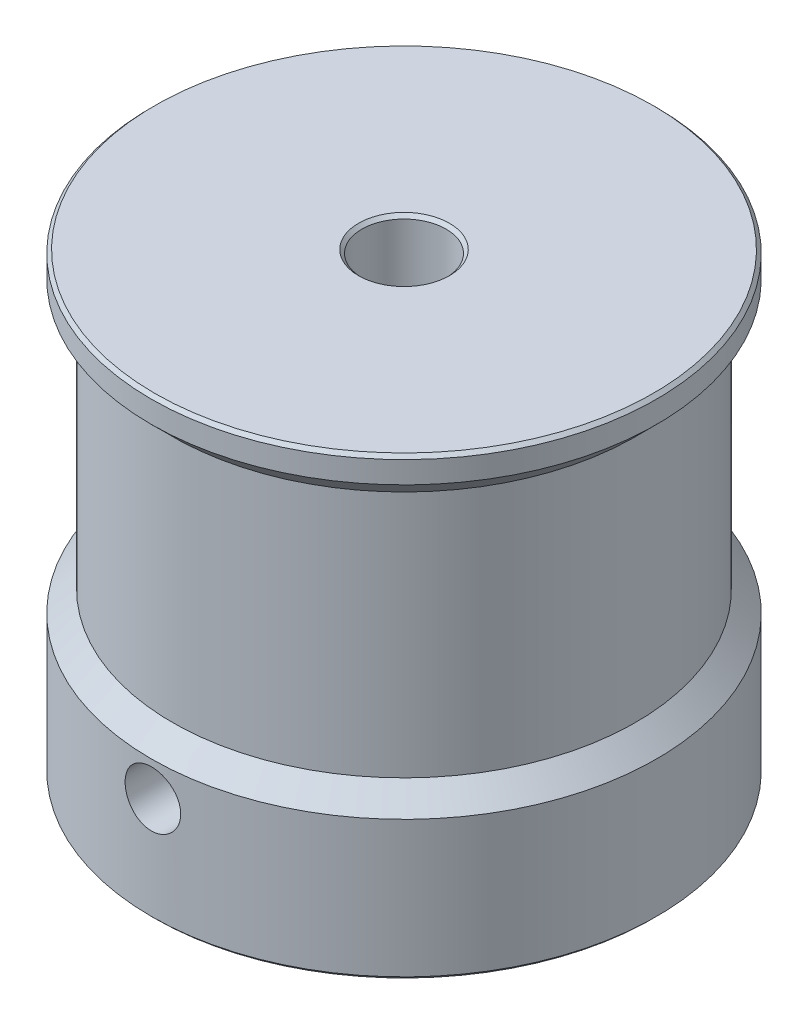
ISO-10303-21;
HEADER;
FILE_DESCRIPTION(('STEP AP214'),'2;1');
FILE_NAME('part.step','',(''),(''),'','','');
FILE_SCHEMA(('AUTOMOTIVE_DESIGN { 1 0 10303 214 1 1 1 1 }'));
ENDSEC;
DATA;
#1=APPLICATION_CONTEXT('core data for automotive mechanical design processes');
#2=APPLICATION_PROTOCOL_DEFINITION('international standard','automotive_design',2000,#1);
#3=PRODUCT_CONTEXT('',#1,'mechanical');
#4=PRODUCT('Part','Part','',(#3));
#5=PRODUCT_RELATED_PRODUCT_CATEGORY('part','',(#4));
#6=PRODUCT_DEFINITION_FORMATION('','',#4);
#7=PRODUCT_DEFINITION_CONTEXT('part definition',#1,'design');
#8=PRODUCT_DEFINITION('design','',#6,#7);
#9=PRODUCT_DEFINITION_SHAPE('','',#8);
#10=(LENGTH_UNIT() NAMED_UNIT(*) SI_UNIT(.MILLI.,.METRE.));
#11=(NAMED_UNIT(*) PLANE_ANGLE_UNIT() SI_UNIT($,.RADIAN.));
#12=(NAMED_UNIT(*) SI_UNIT($,.STERADIAN.) SOLID_ANGLE_UNIT());
#13=UNCERTAINTY_MEASURE_WITH_UNIT(LENGTH_MEASURE(1.E-05),#10,'distance_accuracy_value','');
#14=(GEOMETRIC_REPRESENTATION_CONTEXT(3) GLOBAL_UNCERTAINTY_ASSIGNED_CONTEXT((#13)) GLOBAL_UNIT_ASSIGNED_CONTEXT((#10,
#11,#12)) REPRESENTATION_CONTEXT('',''));
#15=CARTESIAN_POINT('',(0.,0.,0.));
#16=DIRECTION('',(0.,0.,1.));
#17=DIRECTION('',(1.,0.,0.));
#18=AXIS2_PLACEMENT_3D('',#15,#16,#17);
#19=CARTESIAN_POINT('',(11.5,2.5,0.));
#20=DIRECTION('',(0.,-1.,0.));
#21=DIRECTION('',(0.,0.,-1.));
#22=AXIS2_PLACEMENT_3D('',#19,#20,#21);
#23=PLANE('',#22);
#24=CARTESIAN_POINT('',(0.,2.5,0.));
#25=DIRECTION('',(0.,-1.,0.));
#26=DIRECTION('',(0.,0.,-1.));
#27=AXIS2_PLACEMENT_3D('',#24,#25,#26);
#28=CIRCLE('',#27,2.70000000000001);
#29=CARTESIAN_POINT('',(0.,2.5,-2.70000000000001));
#30=VERTEX_POINT('',#29);
#31=EDGE_CURVE('E76',#30,#30,#28,.F.);
#32=ORIENTED_EDGE('',*,*,#31,.T.);
#33=EDGE_LOOP('',(#32));
#34=FACE_BOUND('',#33,.T.);
#35=CARTESIAN_POINT('',(0.,2.5,0.));
#36=DIRECTION('',(0.,-1.,0.));
#37=DIRECTION('',(0.,0.,-1.));
#38=AXIS2_PLACEMENT_3D('',#35,#36,#37);
#39=CIRCLE('',#38,11.5);
#40=CARTESIAN_POINT('',(0.,2.5,-11.5));
#41=VERTEX_POINT('',#40);
#42=EDGE_CURVE('E88',#41,#41,#39,.T.);
#43=ORIENTED_EDGE('',*,*,#42,.T.);
#44=EDGE_LOOP('',(#43));
#45=FACE_BOUND('',#44,.T.);
#46=ADVANCED_FACE('F40',(#34,#45),#23,.T.);
#47=CARTESIAN_POINT('',(0.,0.,0.));
#48=DIRECTION('',(0.,-1.,0.));
#49=DIRECTION('',(0.,0.,-1.));
#50=AXIS2_PLACEMENT_3D('',#47,#48,#49);
#51=CYLINDRICAL_SURFACE('',#50,11.5);
#52=CARTESIAN_POINT('',(0.,0.200000000000007,0.));
#53=DIRECTION('',(0.,-1.,0.));
#54=DIRECTION('',(0.,0.,-1.));
#55=AXIS2_PLACEMENT_3D('',#52,#53,#54);
#56=CIRCLE('',#55,11.5);
#57=CARTESIAN_POINT('',(0.,0.200000000000007,-11.5));
#58=VERTEX_POINT('',#57);
#59=EDGE_CURVE('E58',#58,#58,#56,.T.);
#60=ORIENTED_EDGE('',*,*,#59,.T.);
#61=EDGE_LOOP('',(#60));
#62=FACE_BOUND('',#61,.T.);
#63=ORIENTED_EDGE('',*,*,#42,.F.);
#64=EDGE_LOOP('',(#63));
#65=FACE_BOUND('',#64,.T.);
#66=ADVANCED_FACE('F130',(#62,#65),#51,.F.);
#67=CARTESIAN_POINT('',(15.,0.,0.));
#68=DIRECTION('',(0.,-1.,0.));
#69=DIRECTION('',(0.,0.,-1.));
#70=AXIS2_PLACEMENT_3D('',#67,#68,#69);
#71=PLANE('',#70);
#72=CARTESIAN_POINT('',(0.,0.,0.));
#73=DIRECTION('',(0.,-1.,0.));
#74=DIRECTION('',(0.,0.,-1.));
#75=AXIS2_PLACEMENT_3D('',#72,#73,#74);
#76=CIRCLE('',#75,14.8);
#77=CARTESIAN_POINT('',(0.,0.,-14.8));
#78=VERTEX_POINT('',#77);
#79=EDGE_CURVE('E68',#78,#78,#76,.T.);
#80=ORIENTED_EDGE('',*,*,#79,.T.);
#81=EDGE_LOOP('',(#80));
#82=FACE_BOUND('',#81,.T.);
#83=CARTESIAN_POINT('',(0.,0.,0.));
#84=DIRECTION('',(0.,-1.,0.));
#85=DIRECTION('',(0.,0.,-1.));
#86=AXIS2_PLACEMENT_3D('',#83,#84,#85);
#87=CIRCLE('',#86,11.7);
#88=CARTESIAN_POINT('',(0.,0.,-11.7));
#89=VERTEX_POINT('',#88);
#90=EDGE_CURVE('E72',#89,#89,#87,.F.);
#91=ORIENTED_EDGE('',*,*,#90,.T.);
#92=EDGE_LOOP('',(#91));
#93=FACE_BOUND('',#92,.T.);
#94=ADVANCED_FACE('F125',(#82,#93),#71,.T.);
#95=CARTESIAN_POINT('',(0.,0.,0.));
#96=DIRECTION('',(0.,-1.,0.));
#97=DIRECTION('',(0.,0.,-1.));
#98=AXIS2_PLACEMENT_3D('',#95,#96,#97);
#99=CYLINDRICAL_SURFACE('',#98,15.);
#100=CARTESIAN_POINT('',(0.,0.199999999999979,0.));
#101=DIRECTION('',(0.,-1.,0.));
#102=DIRECTION('',(0.,0.,-1.));
#103=AXIS2_PLACEMENT_3D('',#100,#101,#102);
#104=CIRCLE('',#103,15.);
#105=CARTESIAN_POINT('',(0.,0.199999999999979,-15.));
#106=VERTEX_POINT('',#105);
#107=EDGE_CURVE('E64',#106,#106,#104,.F.);
#108=ORIENTED_EDGE('',*,*,#107,.T.);
#109=EDGE_LOOP('',(#108));
#110=FACE_BOUND('',#109,.T.);
#111=CARTESIAN_POINT('',(0.,4.6,15.));
#112=CARTESIAN_POINT('',(0.0923818218581742,4.60000397407824,14.9999988431375));
#113=CARTESIAN_POINT('',(0.184823472950829,4.60778468265795,14.9991375118722));
#114=CARTESIAN_POINT('',(0.36714038463706,4.63870399434833,14.9957843241747));
#115=CARTESIAN_POINT('',(0.4570127634107,4.66185918763366,14.9932907064293));
#116=CARTESIAN_POINT('',(0.631524868732985,4.72284213795445,14.9869542195955));
#117=CARTESIAN_POINT('',(0.716167852564645,4.76066065247303,14.9831122005694));
#118=CARTESIAN_POINT('',(0.877887506534781,4.84987789047906,14.9745076566348));
#119=CARTESIAN_POINT('',(0.954965599904044,4.90127405277463,14.9697453053767));
#120=CARTESIAN_POINT('',(1.09971749291982,5.01642513016235,14.9598099458213));
#121=CARTESIAN_POINT('',(1.16735402776654,5.08022676384704,14.9546354302355));
#122=CARTESIAN_POINT('',(1.29098229654243,5.21827771795949,14.9444712876292));
#123=CARTESIAN_POINT('',(1.34697347210661,5.29252753906488,14.9394816694836));
#124=CARTESIAN_POINT('',(1.44585644392366,5.4496041169707,14.9302371294103));
#125=CARTESIAN_POINT('',(1.4887140314528,5.53245253227903,14.9259841384625));
#126=CARTESIAN_POINT('',(1.55989482430128,5.70422484675052,14.9187136159983));
#127=CARTESIAN_POINT('',(1.58821845988081,5.79314856597328,14.9156960479094));
#128=CARTESIAN_POINT('',(1.62941572162321,5.97416431324198,14.9112520065666));
#129=CARTESIAN_POINT('',(1.64235163484851,6.06624200529499,14.9098191204392));
#130=CARTESIAN_POINT('',(1.65259886462404,6.25127181424992,14.908686898868));
#131=CARTESIAN_POINT('',(1.64991067288424,6.34422390354157,14.908987508869));
#132=CARTESIAN_POINT('',(1.62903725829947,6.52793281906692,14.9112824512349));
#133=CARTESIAN_POINT('',(1.61092026760878,6.61869750429989,14.9132693261476));
#134=CARTESIAN_POINT('',(1.55980980676325,6.79589026922768,14.9187012894236));
#135=CARTESIAN_POINT('',(1.52681609784369,6.88231827929606,14.9221464011908));
#136=CARTESIAN_POINT('',(1.44681419634299,7.04859852959656,14.9301152023445));
#137=CARTESIAN_POINT('',(1.39977596429643,7.1284362019399,14.9346411994129));
#138=CARTESIAN_POINT('',(1.29304180674751,7.27910998413143,14.944259925937));
#139=CARTESIAN_POINT('',(1.23334543269006,7.34994577484581,14.9493526754732));
#140=CARTESIAN_POINT('',(1.10260955971916,7.48100135292739,14.9595642939927));
#141=CARTESIAN_POINT('',(1.03151117609732,7.54116241529601,14.9646831571922));
#142=CARTESIAN_POINT('',(0.880193329427118,7.64870484603086,14.9743446474524));
#143=CARTESIAN_POINT('',(0.799973852605644,7.69608619509901,14.978887273643));
#144=CARTESIAN_POINT('',(0.6326485491733,7.77672275506591,14.9868864198642));
#145=CARTESIAN_POINT('',(0.545541148541531,7.80997472600503,14.9903426907391));
#146=CARTESIAN_POINT('',(0.366932993265997,7.86136425628381,14.9957772807096));
#147=CARTESIAN_POINT('',(0.275432397824438,7.87950236288869,14.9977556533188));
#148=CARTESIAN_POINT('',(0.0911434787578463,7.90007418859381,15.0000046359516));
#149=CARTESIAN_POINT('',(-0.00163570174845487,7.90258889119219,15.0002840523084));
#150=CARTESIAN_POINT('',(-0.186294166416551,7.89205560627016,14.9991273146614));
#151=CARTESIAN_POINT('',(-0.278173465315143,7.87900787403707,14.9976911887995));
#152=CARTESIAN_POINT('',(-0.45818836055987,7.83778731886137,14.9932703044021));
#153=CARTESIAN_POINT('',(-0.546332803398984,7.80965267471051,14.9902894555646));
#154=CARTESIAN_POINT('',(-0.716651536032794,7.73909634060412,14.9831132635213));
#155=CARTESIAN_POINT('',(-0.798825665625388,7.69667426744437,14.9789178877409));
#156=CARTESIAN_POINT('',(-0.955235638443857,7.5985482782607,14.9697593637147));
#157=CARTESIAN_POINT('',(-1.02943811324488,7.54279146137031,14.9647931858517));
#158=CARTESIAN_POINT('',(-1.1674600255377,7.41965418632295,14.9546593253991));
#159=CARTESIAN_POINT('',(-1.23127914630014,7.35227337372175,14.9494916366686));
#160=CARTESIAN_POINT('',(-1.34700625191035,7.20744616179261,14.9395104302445));
#161=CARTESIAN_POINT('',(-1.39886088486303,7.12995700069063,14.9346985615749));
#162=CARTESIAN_POINT('',(-1.48881961499013,6.96732235207821,14.9259997112416));
#163=CARTESIAN_POINT('',(-1.52692393381705,6.88217698801198,14.9221127146694));
#164=CARTESIAN_POINT('',(-1.5882121698463,6.70682581030272,14.9157144017887));
#165=CARTESIAN_POINT('',(-1.61142720744416,6.61663098279506,14.913200217783));
#166=CARTESIAN_POINT('',(-1.64237859902929,6.43359422001475,14.9098235690547));
#167=CARTESIAN_POINT('',(-1.65011549909774,6.34075237824812,14.9089610460603));
#168=CARTESIAN_POINT('',(-1.64988250778876,6.1555874603336,14.9089867901201));
#169=CARTESIAN_POINT('',(-1.64199642382743,6.06326426608027,14.9098657154103));
#170=CARTESIAN_POINT('',(-1.61091769726743,5.88126321364289,14.9132553441701));
#171=CARTESIAN_POINT('',(-1.58772504262742,5.79158535753993,14.9157660489234));
#172=CARTESIAN_POINT('',(-1.52671583943657,5.61742518682386,14.9221336424926));
#173=CARTESIAN_POINT('',(-1.48890235332836,5.53294178848482,14.9259902493827));
#174=CARTESIAN_POINT('',(-1.39973329169088,5.3715068615654,14.9346156407071));
#175=CARTESIAN_POINT('',(-1.34837769938871,5.29455534231397,14.9393844262711));
#176=CARTESIAN_POINT('',(-1.23326864168925,5.1499392703203,14.9493275259266));
#177=CARTESIAN_POINT('',(-1.16945266430597,5.08232460764932,14.9545038027611));
#178=CARTESIAN_POINT('',(-1.03136150958025,4.95872907899544,14.9646609076263));
#179=CARTESIAN_POINT('',(-0.957083846303533,4.90275098597638,14.969641688842));
#180=CARTESIAN_POINT('',(-0.799929681435437,4.80388123329122,14.9788625057048));
#181=CARTESIAN_POINT('',(-0.717028162742395,4.76102915416637,14.9831002847694));
#182=CARTESIAN_POINT('',(-0.54520988552375,4.68991277149216,14.9903338724846));
#183=CARTESIAN_POINT('',(-0.45629994293742,4.66163224210026,14.993331061833));
#184=CARTESIAN_POINT('',(-0.305751892942927,4.62740874233583,14.9970040251543));
#185=CARTESIAN_POINT('',(-0.245071615108731,4.6171447762129,14.9981221898992));
#186=CARTESIAN_POINT('',(-0.122936388450104,4.60343910055461,14.9996205603388));
#187=CARTESIAN_POINT('',(-0.0614814436954417,4.59999735519324,15.0000007699088));
#188=CARTESIAN_POINT('',(0.,4.6,15.));
#189=B_SPLINE_CURVE_WITH_KNOTS('',3,(#111,#112,#113,#114,#115,#116,#117,#118,#119,#120,#121,
#122,#123,#124,#125,#126,#127,#128,#129,#130,#131,#132,#133,#134,#135,#136,#137,#138,#139,#140,
#141,#142,#143,#144,#145,#146,#147,#148,#149,#150,#151,#152,#153,#154,#155,#156,#157,#158,#159,
#160,#161,#162,#163,#164,#165,#166,#167,#168,#169,#170,#171,#172,#173,#174,#175,#176,#177,#178,
#179,#180,#181,#182,#183,#184,#185,#186,#187,#188),.UNSPECIFIED.,.T.,.F.,(4,2,2,2,2,2,2,2,2,2,2,
2,2,2,2,2,2,2,2,2,2,2,2,2,2,2,2,2,2,2,2,2,2,2,2,2,2,2,4),(0.,0.276920934615254,
0.554141173519899,0.831186959564197,1.10818052291128,1.38623817794144,1.66430916204826,
1.94309839229293,2.22187936884105,2.49952800190879,2.77716789707699,3.05358629881208,
3.33000913709782,3.60702749676351,3.88405567451859,4.16256356312762,4.44107187229719,
4.71964401084108,4.99820606199367,5.27532298117503,5.55243535457279,5.82884975677338,
6.10527157329622,6.38280873719029,6.66035436537182,6.93911468163529,7.21787050413385,
7.49604177805968,7.77420323770547,8.0508765774938,8.32755013493492,8.60416577239308,
8.8807817524617,9.1588228879067,9.43693020406012,9.7158680593081,9.99449463424156,
10.1787905045231,10.3630854069962),.UNSPECIFIED.);
#190=CARTESIAN_POINT('',(0.,4.6,15.));
#191=VERTEX_POINT('',#190);
#192=EDGE_CURVE('E98',#191,#191,#189,.T.);
#193=ORIENTED_EDGE('',*,*,#192,.F.);
#194=EDGE_LOOP('',(#193));
#195=FACE_BOUND('',#194,.T.);
#196=CARTESIAN_POINT('',(0.,8.29999999999894,0.));
#197=DIRECTION('',(0.,-1.,0.));
#198=DIRECTION('',(0.,0.,-1.));
#199=AXIS2_PLACEMENT_3D('',#196,#197,#198);
#200=CIRCLE('',#199,15.);
#201=CARTESIAN_POINT('',(0.,8.29999999999894,-15.));
#202=VERTEX_POINT('',#201);
#203=EDGE_CURVE('E194',#202,#202,#200,.T.);
#204=ORIENTED_EDGE('',*,*,#203,.T.);
#205=EDGE_LOOP('',(#204));
#206=FACE_BOUND('',#205,.T.);
#207=ADVANCED_FACE('F119',(#110,#195,#206),#99,.T.);
#208=CARTESIAN_POINT('',(0.,8.29999999999894,0.));
#209=DIRECTION('',(0.,-1.,0.));
#210=DIRECTION('',(0.,0.,-1.));
#211=AXIS2_PLACEMENT_3D('',#208,#209,#210);
#212=CONICAL_SURFACE('',#211,15.,0.785398163397442);
#213=CARTESIAN_POINT('',(0.,9.54999999999895,0.));
#214=DIRECTION('',(0.,-1.,0.));
#215=DIRECTION('',(0.,0.,-1.));
#216=AXIS2_PLACEMENT_3D('',#213,#214,#215);
#217=CIRCLE('',#216,13.75);
#218=CARTESIAN_POINT('',(0.,9.54999999999895,-13.75));
#219=VERTEX_POINT('',#218);
#220=EDGE_CURVE('E192',#219,#219,#217,.T.);
#221=ORIENTED_EDGE('',*,*,#220,.T.);
#222=EDGE_LOOP('',(#221));
#223=FACE_BOUND('',#222,.T.);
#224=ORIENTED_EDGE('',*,*,#203,.F.);
#225=EDGE_LOOP('',(#224));
#226=FACE_BOUND('',#225,.T.);
#227=ADVANCED_FACE('F124',(#223,#226),#212,.T.);
#228=CARTESIAN_POINT('',(0.,0.,0.));
#229=DIRECTION('',(0.,-1.,0.));
#230=DIRECTION('',(0.,0.,-1.));
#231=AXIS2_PLACEMENT_3D('',#228,#229,#230);
#232=CYLINDRICAL_SURFACE('',#231,13.75);
#233=CARTESIAN_POINT('',(0.,24.249999999999,0.));
#234=DIRECTION('',(0.,-1.,0.));
#235=DIRECTION('',(0.,0.,-1.));
#236=AXIS2_PLACEMENT_3D('',#233,#234,#235);
#237=CIRCLE('',#236,13.75);
#238=CARTESIAN_POINT('',(0.,24.249999999999,-13.75));
#239=VERTEX_POINT('',#238);
#240=EDGE_CURVE('E189',#239,#239,#237,.T.);
#241=ORIENTED_EDGE('',*,*,#240,.T.);
#242=EDGE_LOOP('',(#241));
#243=FACE_BOUND('',#242,.T.);
#244=ORIENTED_EDGE('',*,*,#220,.F.);
#245=EDGE_LOOP('',(#244));
#246=FACE_BOUND('',#245,.T.);
#247=ADVANCED_FACE('F178',(#243,#246),#232,.T.);
#248=CARTESIAN_POINT('',(0.,24.249999999999,0.));
#249=DIRECTION('',(0.,1.,0.));
#250=DIRECTION('',(0.,0.,1.));
#251=AXIS2_PLACEMENT_3D('',#248,#249,#250);
#252=CONICAL_SURFACE('',#251,13.75,0.78539816339745);
#253=CARTESIAN_POINT('',(0.,25.499999999999,0.));
#254=DIRECTION('',(0.,-1.,0.));
#255=DIRECTION('',(0.,0.,-1.));
#256=AXIS2_PLACEMENT_3D('',#253,#254,#255);
#257=CIRCLE('',#256,15.);
#258=CARTESIAN_POINT('',(0.,25.499999999999,-15.));
#259=VERTEX_POINT('',#258);
#260=EDGE_CURVE('E117',#259,#259,#257,.T.);
#261=ORIENTED_EDGE('',*,*,#260,.T.);
#262=EDGE_LOOP('',(#261));
#263=FACE_BOUND('',#262,.T.);
#264=ORIENTED_EDGE('',*,*,#240,.F.);
#265=EDGE_LOOP('',(#264));
#266=FACE_BOUND('',#265,.T.);
#267=ADVANCED_FACE('F173',(#263,#266),#252,.T.);
#268=CARTESIAN_POINT('',(0.,0.,0.));
#269=DIRECTION('',(0.,-1.,0.));
#270=DIRECTION('',(0.,0.,-1.));
#271=AXIS2_PLACEMENT_3D('',#268,#269,#270);
#272=CYLINDRICAL_SURFACE('',#271,15.);
#273=CARTESIAN_POINT('',(0.,26.799999999999,0.));
#274=DIRECTION('',(0.,1.,0.));
#275=DIRECTION('',(0.,0.,1.));
#276=AXIS2_PLACEMENT_3D('',#273,#274,#275);
#277=CIRCLE('',#276,15.);
#278=CARTESIAN_POINT('',(0.,26.799999999999,15.));
#279=VERTEX_POINT('',#278);
#280=EDGE_CURVE('E10',#279,#279,#277,.F.);
#281=ORIENTED_EDGE('',*,*,#280,.T.);
#282=EDGE_LOOP('',(#281));
#283=FACE_BOUND('',#282,.T.);
#284=ORIENTED_EDGE('',*,*,#260,.F.);
#285=EDGE_LOOP('',(#284));
#286=FACE_BOUND('',#285,.T.);
#287=ADVANCED_FACE('F167',(#283,#286),#272,.T.);
#288=CARTESIAN_POINT('',(15.,26.999999999999,0.));
#289=DIRECTION('',(0.,1.,0.));
#290=DIRECTION('',(0.,0.,1.));
#291=AXIS2_PLACEMENT_3D('',#288,#289,#290);
#292=PLANE('',#291);
#293=CARTESIAN_POINT('',(0.,26.999999999999,0.));
#294=DIRECTION('',(0.,1.,0.));
#295=DIRECTION('',(0.,0.,1.));
#296=AXIS2_PLACEMENT_3D('',#293,#294,#295);
#297=CIRCLE('',#296,2.70000000000001);
#298=CARTESIAN_POINT('',(0.,26.999999999999,2.70000000000001));
#299=VERTEX_POINT('',#298);
#300=EDGE_CURVE('E48',#299,#299,#297,.F.);
#301=ORIENTED_EDGE('',*,*,#300,.T.);
#302=EDGE_LOOP('',(#301));
#303=FACE_BOUND('',#302,.T.);
#304=CARTESIAN_POINT('',(0.,26.999999999999,0.));
#305=DIRECTION('',(0.,1.,0.));
#306=DIRECTION('',(0.,0.,1.));
#307=AXIS2_PLACEMENT_3D('',#304,#305,#306);
#308=CIRCLE('',#307,14.8);
#309=CARTESIAN_POINT('',(0.,26.999999999999,14.8));
#310=VERTEX_POINT('',#309);
#311=EDGE_CURVE('E53',#310,#310,#308,.T.);
#312=ORIENTED_EDGE('',*,*,#311,.T.);
#313=EDGE_LOOP('',(#312));
#314=FACE_BOUND('',#313,.T.);
#315=ADVANCED_FACE('F160',(#303,#314),#292,.T.);
#316=CARTESIAN_POINT('',(0.,0.,0.));
#317=DIRECTION('',(0.,-1.,0.));
#318=DIRECTION('',(0.,0.,-1.));
#319=AXIS2_PLACEMENT_3D('',#316,#317,#318);
#320=CYLINDRICAL_SURFACE('',#319,2.50000000000001);
#321=CARTESIAN_POINT('',(0.,2.70000000000001,0.));
#322=DIRECTION('',(0.,-1.,0.));
#323=DIRECTION('',(0.,0.,-1.));
#324=AXIS2_PLACEMENT_3D('',#321,#322,#323);
#325=CIRCLE('',#324,2.50000000000001);
#326=CARTESIAN_POINT('',(0.,2.70000000000001,-2.50000000000001));
#327=VERTEX_POINT('',#326);
#328=EDGE_CURVE('E80',#327,#327,#325,.T.);
#329=ORIENTED_EDGE('',*,*,#328,.T.);
#330=EDGE_LOOP('',(#329));
#331=FACE_BOUND('',#330,.T.);
#332=CARTESIAN_POINT('',(0.,26.799999999999,0.));
#333=DIRECTION('',(0.,1.,0.));
#334=DIRECTION('',(0.,0.,1.));
#335=AXIS2_PLACEMENT_3D('',#332,#333,#334);
#336=CIRCLE('',#335,2.50000000000001);
#337=CARTESIAN_POINT('',(0.,26.799999999999,2.50000000000001));
#338=VERTEX_POINT('',#337);
#339=EDGE_CURVE('E84',#338,#338,#336,.T.);
#340=ORIENTED_EDGE('',*,*,#339,.T.);
#341=EDGE_LOOP('',(#340));
#342=FACE_BOUND('',#341,.T.);
#343=CARTESIAN_POINT('',(-1.65,6.25,1.87816399709931));
#344=CARTESIAN_POINT('',(-1.64999443072166,6.33079427655975,1.87817356740868));
#345=CARTESIAN_POINT('',(-1.64401449371115,6.41162636905579,1.88347418282793));
#346=CARTESIAN_POINT('',(-1.62058860250622,6.57041795060532,1.90365752241833));
#347=CARTESIAN_POINT('',(-1.60312206083479,6.64837201591593,1.91855745048961));
#348=CARTESIAN_POINT('',(-1.5580772753857,6.79863333158224,1.95530612756549));
#349=CARTESIAN_POINT('',(-1.53059477126484,6.87098643150526,1.97708883218857));
#350=CARTESIAN_POINT('',(-1.46657517741325,7.00994524738078,2.02503214275445));
#351=CARTESIAN_POINT('',(-1.43003610611276,7.07654970122849,2.05119370638086));
#352=CARTESIAN_POINT('',(-1.342483593019,7.21321736687682,2.10971828562919));
#353=CARTESIAN_POINT('',(-1.29011420470094,7.28226727651007,2.14241946389368));
#354=CARTESIAN_POINT('',(-1.17514144468481,7.41147714614391,2.20758221587982));
#355=CARTESIAN_POINT('',(-1.11252840012498,7.47162860029669,2.24004353252864));
#356=CARTESIAN_POINT('',(-0.968234915676892,7.58973271619889,2.30644197677161));
#357=CARTESIAN_POINT('',(-0.885111648041917,7.64619090363769,2.33994640603817));
#358=CARTESIAN_POINT('',(-0.707908997031472,7.74384115428656,2.39949293751456));
#359=CARTESIAN_POINT('',(-0.613841755901937,7.78504992824282,2.42554320107046));
#360=CARTESIAN_POINT('',(-0.428365536633281,7.84607361226672,2.46464353514928));
#361=CARTESIAN_POINT('',(-0.337811072451686,7.86774914948944,2.47881191391303));
#362=CARTESIAN_POINT('',(-0.153380704926459,7.89549014711654,2.49700266516609));
#363=CARTESIAN_POINT('',(-0.0595090091735679,7.90157471024375,2.50103745363968));
#364=CARTESIAN_POINT('',(0.113712663637904,7.89800862462096,2.49868729659539));
#365=CARTESIAN_POINT('',(0.193140500290941,7.89056933208685,2.49376656842583));
#366=CARTESIAN_POINT('',(0.34933830819111,7.86453692457822,2.47671798966374));
#367=CARTESIAN_POINT('',(0.426108083336224,7.84594298850181,2.46458960851096));
#368=CARTESIAN_POINT('',(0.574862419576158,7.79858528412734,2.4341916732427));
#369=CARTESIAN_POINT('',(0.646859815580459,7.76985022722839,2.41593946394569));
#370=CARTESIAN_POINT('',(0.785017034503292,7.70331789592823,2.37464804586783));
#371=CARTESIAN_POINT('',(0.851175752075163,7.66551891060689,2.35160793342518));
#372=CARTESIAN_POINT('',(0.985047000791316,7.5764481916351,2.29902245001357));
#373=CARTESIAN_POINT('',(1.05183695764556,7.52406230137878,2.26902056419846));
#374=CARTESIAN_POINT('',(1.17625968695308,7.41019022775839,2.2070921891754));
#375=CARTESIAN_POINT('',(1.23387810796581,7.34869006733423,2.17516278943165));
#376=CARTESIAN_POINT('',(1.34724934289722,7.20750690257425,2.10711048312635));
#377=CARTESIAN_POINT('',(1.40139996434747,7.12648069757491,2.07108428413496));
#378=CARTESIAN_POINT('',(1.49525229324493,6.95447022283534,2.0043795765937));
#379=CARTESIAN_POINT('',(1.53497883258692,6.8635034211415,1.973691925336));
#380=CARTESIAN_POINT('',(1.58906609884217,6.70004901179961,1.93021206234819));
#381=CARTESIAN_POINT('',(1.60742065844978,6.62958306194073,1.91481376393407));
#382=CARTESIAN_POINT('',(1.63471528383589,6.48568483824098,1.89156962487726));
#383=CARTESIAN_POINT('',(1.64367111218458,6.41225774603094,1.88371114115));
#384=CARTESIAN_POINT('',(1.65161100823905,6.26413898103529,1.8767563549997));
#385=CARTESIAN_POINT('',(1.65055550398267,6.18944345582033,1.87769482426888));
#386=CARTESIAN_POINT('',(1.63845508785891,6.04146670785288,1.88825914723377));
#387=CARTESIAN_POINT('',(1.62740194790477,5.96818670082213,1.89789215655036));
#388=CARTESIAN_POINT('',(1.59670654181038,5.82815606994752,1.92377320788271));
#389=CARTESIAN_POINT('',(1.57745493961548,5.7612601566981,1.9397182942886));
#390=CARTESIAN_POINT('',(1.53127715983158,5.63158821030647,1.97637475195715));
#391=CARTESIAN_POINT('',(1.5043484373163,5.56881355184297,1.99708770330354));
#392=CARTESIAN_POINT('',(1.43744371796296,5.43584653371123,2.04592024038531));
#393=CARTESIAN_POINT('',(1.39593741519331,5.36666627761783,2.0746933834994));
#394=CARTESIAN_POINT('',(1.30370192953133,5.2354540035836,2.13386307226145));
#395=CARTESIAN_POINT('',(1.25296152557761,5.17343083426984,2.16426156090022));
#396=CARTESIAN_POINT('',(1.13132559349667,5.04502279309446,2.23066104299162));
#397=CARTESIAN_POINT('',(1.05843368437051,4.98042825569478,2.2665075285833));
#398=CARTESIAN_POINT('',(0.901029136145243,4.86429294484174,2.33354741548987));
#399=CARTESIAN_POINT('',(0.816527594120807,4.81273983785047,2.36474520160668));
#400=CARTESIAN_POINT('',(0.655022436944617,4.73346296196824,2.41383928477658));
#401=CARTESIAN_POINT('',(0.579766982761497,4.70305320616478,2.43314294605933));
#402=CARTESIAN_POINT('',(0.424305717798099,4.65340770004291,2.46500344203447));
#403=CARTESIAN_POINT('',(0.344104114697716,4.63416259316717,2.47756592552064));
#404=CARTESIAN_POINT('',(0.180532057501474,4.60780779187865,2.49483359194806));
#405=CARTESIAN_POINT('',(0.097149920346806,4.60074836698325,2.4995062252213));
#406=CARTESIAN_POINT('',(-0.0697703046886405,4.59936521725825,2.50041880991433));
#407=CARTESIAN_POINT('',(-0.153308385299498,4.60504091284883,2.49665914509097));
#408=CARTESIAN_POINT('',(-0.312248842068663,4.6279594817533,2.48162224491364));
#409=CARTESIAN_POINT('',(-0.387820405838233,4.64439826797344,2.47086791156198));
#410=CARTESIAN_POINT('',(-0.534890956581197,4.68722616352496,2.44325497490619));
#411=CARTESIAN_POINT('',(-0.606389301510786,4.71361683656131,2.42639541232541));
#412=CARTESIAN_POINT('',(-0.748299731069996,4.77725696718864,2.38659098522816));
#413=CARTESIAN_POINT('',(-0.818362050887254,4.81508395318078,2.36333062488107));
#414=CARTESIAN_POINT('',(-0.951399734920279,4.89960758414193,2.31298664760704));
#415=CARTESIAN_POINT('',(-1.01437047747239,4.94630996063964,2.2859005630314));
#416=CARTESIAN_POINT('',(-1.14186276834818,5.05552907515257,2.2252813274897));
#417=CARTESIAN_POINT('',(-1.20508031729177,5.11937720174745,2.19140310364952));
#418=CARTESIAN_POINT('',(-1.32046767601712,5.25656834044152,2.12387294022857));
#419=CARTESIAN_POINT('',(-1.37263030790415,5.32991747200144,2.09022116132147));
#420=CARTESIAN_POINT('',(-1.46053735742483,5.47797320198262,2.02963185186415));
#421=CARTESIAN_POINT('',(-1.49736813204505,5.55189495776457,2.0023603082731));
#422=CARTESIAN_POINT('',(-1.55999123252305,5.70610913288329,1.95397052678843));
#423=CARTESIAN_POINT('',(-1.58580711054237,5.78638751989308,1.93283919103844));
#424=CARTESIAN_POINT('',(-1.62004735146957,5.9306913968137,1.90415675714693));
#425=CARTESIAN_POINT('',(-1.63122690692697,5.99364690760695,1.89451740482452));
#426=CARTESIAN_POINT('',(-1.64620346660994,6.12106080182247,1.88151889606353));
#427=CARTESIAN_POINT('',(-1.65000444482246,6.18551835732424,1.87815635906731));
#428=CARTESIAN_POINT('',(-1.65,6.25,1.87816399709931));
#429=B_SPLINE_CURVE_WITH_KNOTS('',3,(#343,#344,#345,#346,#347,#348,#349,#350,#351,#352,#353,
#354,#355,#356,#357,#358,#359,#360,#361,#362,#363,#364,#365,#366,#367,#368,#369,#370,#371,#372,
#373,#374,#375,#376,#377,#378,#379,#380,#381,#382,#383,#384,#385,#386,#387,#388,#389,#390,#391,
#392,#393,#394,#395,#396,#397,#398,#399,#400,#401,#402,#403,#404,#405,#406,#407,#408,#409,#410,
#411,#412,#413,#414,#415,#416,#417,#418,#419,#420,#421,#422,#423,#424,#425,#426,#427,#428),
.UNSPECIFIED.,.T.,.F.,(4,2,2,2,2,2,2,2,2,2,2,2,2,2,2,2,2,2,2,2,2,2,2,2,2,2,2,2,2,2,2,2,2,2,2,2,
2,2,2,2,2,2,4),(0.,0.242089089232209,0.484613262365226,0.72487754222912,0.965194438206268,
1.24204242334406,1.51915335508711,1.83517136959405,2.15084204970881,2.43163690958527,
2.71208756281943,2.9507129324479,3.18935586962918,3.4273285139579,3.66534611375404,
3.93440451568684,4.203879881767,4.51414003592555,4.82386349786491,5.0462567712386,
5.26827647088754,5.49117411610793,5.71425537389903,5.92772322794785,6.14126192794926,
6.39732261532283,6.65369656488884,6.96356575078111,7.27314078239638,7.5223841368641,
7.77141830954323,8.02147738775787,8.27152508592674,8.50474641601319,8.73800440662636,
8.98590102363146,9.2339582740861,9.52089661145363,9.80802068929723,10.067982581361,
10.3273858003361,10.520700440269,10.7139109350251),.UNSPECIFIED.);
#430=CARTESIAN_POINT('',(-1.65,6.25,1.87816399709931));
#431=VERTEX_POINT('',#430);
#432=EDGE_CURVE('E89',#431,#431,#429,.T.);
#433=ORIENTED_EDGE('',*,*,#432,.F.);
#434=EDGE_LOOP('',(#433));
#435=FACE_BOUND('',#434,.T.);
#436=ADVANCED_FACE('F100',(#331,#342,#435),#320,.F.);
#437=CARTESIAN_POINT('',(0.,6.25,0.));
#438=DIRECTION('',(0.,0.,-1.));
#439=DIRECTION('',(-1.,0.,0.));
#440=AXIS2_PLACEMENT_3D('',#437,#438,#439);
#441=CYLINDRICAL_SURFACE('',#440,1.65);
#442=ORIENTED_EDGE('',*,*,#192,.T.);
#443=EDGE_LOOP('',(#442));
#444=FACE_BOUND('',#443,.T.);
#445=ORIENTED_EDGE('',*,*,#432,.T.);
#446=EDGE_LOOP('',(#445));
#447=FACE_BOUND('',#446,.T.);
#448=ADVANCED_FACE('F103',(#444,#447),#441,.F.);
#449=CARTESIAN_POINT('',(0.,2.70000000000001,0.));
#450=DIRECTION('',(0.,-1.,0.));
#451=DIRECTION('',(0.,0.,-1.));
#452=AXIS2_PLACEMENT_3D('',#449,#450,#451);
#453=CONICAL_SURFACE('',#452,2.50000000000001,0.785398163397432);
#454=ORIENTED_EDGE('',*,*,#31,.F.);
#455=EDGE_LOOP('',(#454));
#456=FACE_BOUND('',#455,.T.);
#457=ORIENTED_EDGE('',*,*,#328,.F.);
#458=EDGE_LOOP('',(#457));
#459=FACE_BOUND('',#458,.T.);
#460=ADVANCED_FACE('F106',(#456,#459),#453,.F.);
#461=CARTESIAN_POINT('',(0.,0.,0.));
#462=DIRECTION('',(0.,1.,0.));
#463=DIRECTION('',(0.,0.,1.));
#464=AXIS2_PLACEMENT_3D('',#461,#462,#463);
#465=CONICAL_SURFACE('',#464,14.8,0.785398163397457);
#466=ORIENTED_EDGE('',*,*,#107,.F.);
#467=EDGE_LOOP('',(#466));
#468=FACE_BOUND('',#467,.T.);
#469=ORIENTED_EDGE('',*,*,#79,.F.);
#470=EDGE_LOOP('',(#469));
#471=FACE_BOUND('',#470,.T.);
#472=ADVANCED_FACE('F140',(#468,#471),#465,.T.);
#473=CARTESIAN_POINT('',(0.,0.200000000000007,0.));
#474=DIRECTION('',(0.,-1.,0.));
#475=DIRECTION('',(0.,0.,-1.));
#476=AXIS2_PLACEMENT_3D('',#473,#474,#475);
#477=CONICAL_SURFACE('',#476,11.5,0.785398163397435);
#478=ORIENTED_EDGE('',*,*,#90,.F.);
#479=EDGE_LOOP('',(#478));
#480=FACE_BOUND('',#479,.T.);
#481=ORIENTED_EDGE('',*,*,#59,.F.);
#482=EDGE_LOOP('',(#481));
#483=FACE_BOUND('',#482,.T.);
#484=ADVANCED_FACE('F144',(#480,#483),#477,.F.);
#485=CARTESIAN_POINT('',(0.,26.999999999999,0.));
#486=DIRECTION('',(0.,1.,0.));
#487=DIRECTION('',(0.,0.,1.));
#488=AXIS2_PLACEMENT_3D('',#485,#486,#487);
#489=CONICAL_SURFACE('',#488,2.70000000000001,0.785398163397446);
#490=ORIENTED_EDGE('',*,*,#339,.F.);
#491=EDGE_LOOP('',(#490));
#492=FACE_BOUND('',#491,.T.);
#493=ORIENTED_EDGE('',*,*,#300,.F.);
#494=EDGE_LOOP('',(#493));
#495=FACE_BOUND('',#494,.T.);
#496=ADVANCED_FACE('F147',(#492,#495),#489,.F.);
#497=CARTESIAN_POINT('',(0.,26.799999999999,0.));
#498=DIRECTION('',(0.,-1.,0.));
#499=DIRECTION('',(0.,0.,-1.));
#500=AXIS2_PLACEMENT_3D('',#497,#498,#499);
#501=CONICAL_SURFACE('',#500,15.,0.785398163397461);
#502=ORIENTED_EDGE('',*,*,#311,.F.);
#503=EDGE_LOOP('',(#502));
#504=FACE_BOUND('',#503,.T.);
#505=ORIENTED_EDGE('',*,*,#280,.F.);
#506=EDGE_LOOP('',(#505));
#507=FACE_BOUND('',#506,.T.);
#508=ADVANCED_FACE('F42',(#504,#507),#501,.T.);
#509=CLOSED_SHELL('',(#46,#66,#94,#207,#227,#247,#267,#287,#315,#436,#448,#460,#472,#484,#496,#508));
#510=MANIFOLD_SOLID_BREP('B2',#509);
#511=ADVANCED_BREP_SHAPE_REPRESENTATION('',(#18,#510),#14);
#512=SHAPE_DEFINITION_REPRESENTATION(#9,#511);
ENDSEC;
END-ISO-10303-21;
